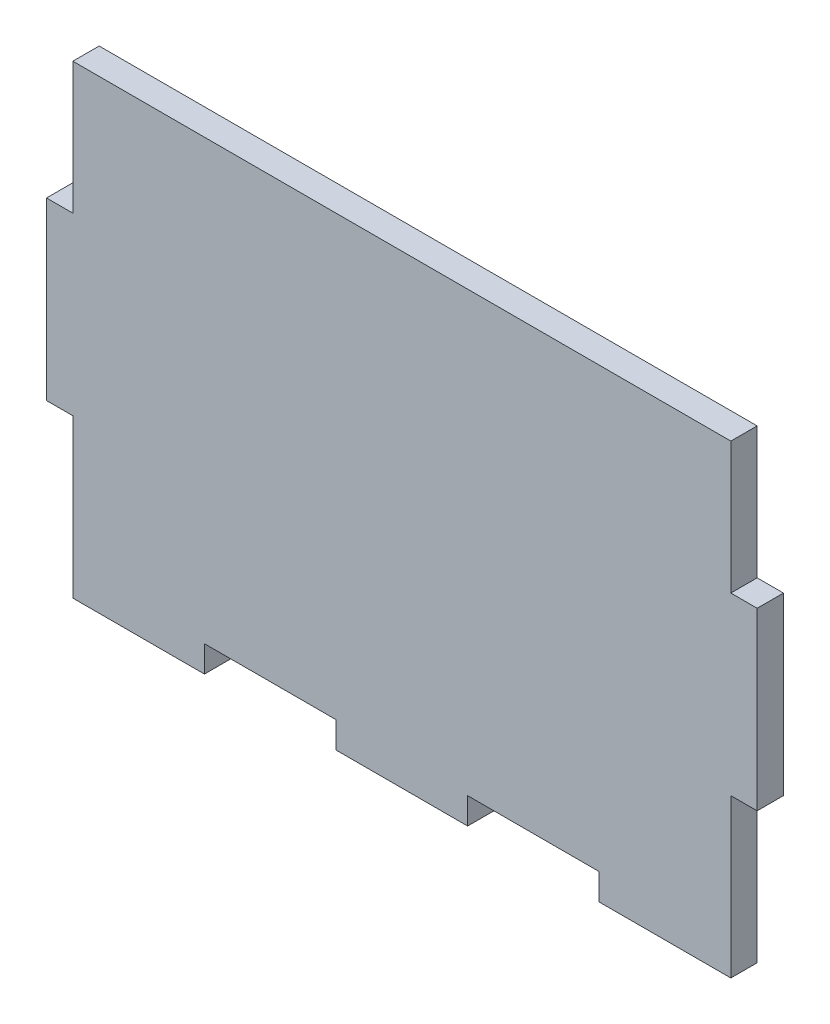
ISO-10303-21;
HEADER;
FILE_DESCRIPTION(('STEP AP214'),'2;1');
FILE_NAME('part.step','',(''),(''),'','','');
FILE_SCHEMA(('AUTOMOTIVE_DESIGN { 1 0 10303 214 1 1 1 1 }'));
ENDSEC;
DATA;
#1=APPLICATION_CONTEXT('core data for automotive mechanical design processes');
#2=APPLICATION_PROTOCOL_DEFINITION('international standard','automotive_design',2000,#1);
#3=PRODUCT_CONTEXT('',#1,'mechanical');
#4=PRODUCT('Part','Part','',(#3));
#5=PRODUCT_RELATED_PRODUCT_CATEGORY('part','',(#4));
#6=PRODUCT_DEFINITION_FORMATION('','',#4);
#7=PRODUCT_DEFINITION_CONTEXT('part definition',#1,'design');
#8=PRODUCT_DEFINITION('design','',#6,#7);
#9=PRODUCT_DEFINITION_SHAPE('','',#8);
#10=(LENGTH_UNIT() NAMED_UNIT(*) SI_UNIT(.MILLI.,.METRE.));
#11=(NAMED_UNIT(*) PLANE_ANGLE_UNIT() SI_UNIT($,.RADIAN.));
#12=(NAMED_UNIT(*) SI_UNIT($,.STERADIAN.) SOLID_ANGLE_UNIT());
#13=UNCERTAINTY_MEASURE_WITH_UNIT(LENGTH_MEASURE(1.E-05),#10,'distance_accuracy_value','');
#14=(GEOMETRIC_REPRESENTATION_CONTEXT(3) GLOBAL_UNCERTAINTY_ASSIGNED_CONTEXT((#13)) GLOBAL_UNIT_ASSIGNED_CONTEXT((#10,
#11,#12)) REPRESENTATION_CONTEXT('',''));
#15=CARTESIAN_POINT('',(0.,0.,0.));
#16=DIRECTION('',(0.,0.,1.));
#17=DIRECTION('',(1.,0.,0.));
#18=AXIS2_PLACEMENT_3D('',#15,#16,#17);
#19=CARTESIAN_POINT('',(-75.,50.,6.));
#20=DIRECTION('',(1.,0.,0.));
#21=DIRECTION('',(0.,0.,-1.));
#22=AXIS2_PLACEMENT_3D('',#19,#20,#21);
#23=PLANE('',#22);
#24=DIRECTION('',(0.,0.,1.));
#25=VECTOR('',#24,1.);
#26=CARTESIAN_POINT('',(-75.,-20.,0.));
#27=LINE('',#26,#25);
#28=CARTESIAN_POINT('',(-75.,-20.,0.));
#29=VERTEX_POINT('',#28);
#30=CARTESIAN_POINT('',(-75.,-20.,6.));
#31=VERTEX_POINT('',#30);
#32=EDGE_CURVE('E192',#29,#31,#27,.T.);
#33=ORIENTED_EDGE('',*,*,#32,.F.);
#34=DIRECTION('',(0.,-1.,0.));
#35=VECTOR('',#34,1.);
#36=CARTESIAN_POINT('',(-75.,50.,0.));
#37=LINE('',#36,#35);
#38=CARTESIAN_POINT('',(-75.,-56.,0.));
#39=VERTEX_POINT('',#38);
#40=EDGE_CURVE('E293',#29,#39,#37,.T.);
#41=ORIENTED_EDGE('',*,*,#40,.T.);
#42=DIRECTION('',(0.,0.,-1.));
#43=VECTOR('',#42,1.);
#44=CARTESIAN_POINT('',(-75.,-56.,6.));
#45=LINE('',#44,#43);
#46=CARTESIAN_POINT('',(-75.,-56.,6.));
#47=VERTEX_POINT('',#46);
#48=EDGE_CURVE('E275',#47,#39,#45,.T.);
#49=ORIENTED_EDGE('',*,*,#48,.F.);
#50=DIRECTION('',(0.,-1.,0.));
#51=VECTOR('',#50,1.);
#52=CARTESIAN_POINT('',(-75.,50.,6.));
#53=LINE('',#52,#51);
#54=EDGE_CURVE('E50',#31,#47,#53,.T.);
#55=ORIENTED_EDGE('',*,*,#54,.F.);
#56=EDGE_LOOP('',(#33,#41,#49,#55));
#57=FACE_BOUND('',#56,.T.);
#58=ADVANCED_FACE('F36',(#57),#23,.F.);
#59=DIRECTION('',(0.,0.,-1.));
#60=VECTOR('',#59,1.);
#61=CARTESIAN_POINT('',(-75.,20.,0.));
#62=LINE('',#61,#60);
#63=CARTESIAN_POINT('',(-75.,20.,6.));
#64=VERTEX_POINT('',#63);
#65=CARTESIAN_POINT('',(-75.,20.,0.));
#66=VERTEX_POINT('',#65);
#67=EDGE_CURVE('E58',#64,#66,#62,.T.);
#68=ORIENTED_EDGE('',*,*,#67,.F.);
#69=CARTESIAN_POINT('',(-75.,50.,6.));
#70=VERTEX_POINT('',#69);
#71=EDGE_CURVE('E195',#70,#64,#53,.T.);
#72=ORIENTED_EDGE('',*,*,#71,.F.);
#73=DIRECTION('',(0.,0.,-1.));
#74=VECTOR('',#73,1.);
#75=CARTESIAN_POINT('',(-75.,50.,6.));
#76=LINE('',#75,#74);
#77=CARTESIAN_POINT('',(-75.,50.,0.));
#78=VERTEX_POINT('',#77);
#79=EDGE_CURVE('E43',#70,#78,#76,.T.);
#80=ORIENTED_EDGE('',*,*,#79,.T.);
#81=EDGE_CURVE('E305',#78,#66,#37,.T.);
#82=ORIENTED_EDGE('',*,*,#81,.T.);
#83=EDGE_LOOP('',(#68,#72,#80,#82));
#84=FACE_BOUND('',#83,.T.);
#85=ADVANCED_FACE('F317',(#84),#23,.F.);
#86=CARTESIAN_POINT('',(75.,50.,6.));
#87=DIRECTION('',(-1.,0.,0.));
#88=DIRECTION('',(0.,0.,1.));
#89=AXIS2_PLACEMENT_3D('',#86,#87,#88);
#90=PLANE('',#89);
#91=DIRECTION('',(0.,0.,1.));
#92=VECTOR('',#91,1.);
#93=CARTESIAN_POINT('',(75.,20.,6.));
#94=LINE('',#93,#92);
#95=CARTESIAN_POINT('',(75.,20.,0.));
#96=VERTEX_POINT('',#95);
#97=CARTESIAN_POINT('',(75.,20.,6.));
#98=VERTEX_POINT('',#97);
#99=EDGE_CURVE('E199',#96,#98,#94,.T.);
#100=ORIENTED_EDGE('',*,*,#99,.F.);
#101=DIRECTION('',(0.,1.,0.));
#102=VECTOR('',#101,1.);
#103=CARTESIAN_POINT('',(75.,50.,0.));
#104=LINE('',#103,#102);
#105=CARTESIAN_POINT('',(75.,50.,0.));
#106=VERTEX_POINT('',#105);
#107=EDGE_CURVE('E310',#96,#106,#104,.T.);
#108=ORIENTED_EDGE('',*,*,#107,.T.);
#109=DIRECTION('',(0.,0.,-1.));
#110=VECTOR('',#109,1.);
#111=CARTESIAN_POINT('',(75.,50.,6.));
#112=LINE('',#111,#110);
#113=CARTESIAN_POINT('',(75.,50.,6.));
#114=VERTEX_POINT('',#113);
#115=EDGE_CURVE('E11',#114,#106,#112,.T.);
#116=ORIENTED_EDGE('',*,*,#115,.F.);
#117=DIRECTION('',(0.,1.,0.));
#118=VECTOR('',#117,1.);
#119=CARTESIAN_POINT('',(75.,50.,6.));
#120=LINE('',#119,#118);
#121=EDGE_CURVE('E299',#98,#114,#120,.T.);
#122=ORIENTED_EDGE('',*,*,#121,.F.);
#123=EDGE_LOOP('',(#100,#108,#116,#122));
#124=FACE_BOUND('',#123,.T.);
#125=ADVANCED_FACE('F390',(#124),#90,.F.);
#126=DIRECTION('',(0.,0.,-1.));
#127=VECTOR('',#126,1.);
#128=CARTESIAN_POINT('',(75.,-20.,6.));
#129=LINE('',#128,#127);
#130=CARTESIAN_POINT('',(75.,-20.,6.));
#131=VERTEX_POINT('',#130);
#132=CARTESIAN_POINT('',(75.,-20.,0.));
#133=VERTEX_POINT('',#132);
#134=EDGE_CURVE('E196',#131,#133,#129,.T.);
#135=ORIENTED_EDGE('',*,*,#134,.F.);
#136=CARTESIAN_POINT('',(75.,-56.,6.));
#137=VERTEX_POINT('',#136);
#138=EDGE_CURVE('E300',#137,#131,#120,.T.);
#139=ORIENTED_EDGE('',*,*,#138,.F.);
#140=DIRECTION('',(0.,0.,1.));
#141=VECTOR('',#140,1.);
#142=CARTESIAN_POINT('',(75.,-56.,6.));
#143=LINE('',#142,#141);
#144=CARTESIAN_POINT('',(75.,-56.,0.));
#145=VERTEX_POINT('',#144);
#146=EDGE_CURVE('E229',#145,#137,#143,.T.);
#147=ORIENTED_EDGE('',*,*,#146,.F.);
#148=EDGE_CURVE('E311',#145,#133,#104,.T.);
#149=ORIENTED_EDGE('',*,*,#148,.T.);
#150=EDGE_LOOP('',(#135,#139,#147,#149));
#151=FACE_BOUND('',#150,.T.);
#152=ADVANCED_FACE('F373',(#151),#90,.F.);
#153=CARTESIAN_POINT('',(75.,-50.,6.));
#154=DIRECTION('',(0.,1.,0.));
#155=DIRECTION('',(-1.,0.,0.));
#156=AXIS2_PLACEMENT_3D('',#153,#154,#155);
#157=PLANE('',#156);
#158=DIRECTION('',(0.,0.,-1.));
#159=VECTOR('',#158,1.);
#160=CARTESIAN_POINT('',(45.,-50.,6.));
#161=LINE('',#160,#159);
#162=CARTESIAN_POINT('',(45.,-50.,6.));
#163=VERTEX_POINT('',#162);
#164=CARTESIAN_POINT('',(45.,-50.,0.));
#165=VERTEX_POINT('',#164);
#166=EDGE_CURVE('E228',#163,#165,#161,.T.);
#167=ORIENTED_EDGE('',*,*,#166,.F.);
#168=DIRECTION('',(1.,0.,0.));
#169=VECTOR('',#168,1.);
#170=CARTESIAN_POINT('',(75.,-50.,6.));
#171=LINE('',#170,#169);
#172=CARTESIAN_POINT('',(15.,-50.,6.));
#173=VERTEX_POINT('',#172);
#174=EDGE_CURVE('E295',#173,#163,#171,.T.);
#175=ORIENTED_EDGE('',*,*,#174,.F.);
#176=DIRECTION('',(0.,0.,1.));
#177=VECTOR('',#176,1.);
#178=CARTESIAN_POINT('',(15.,-50.,6.));
#179=LINE('',#178,#177);
#180=CARTESIAN_POINT('',(15.,-50.,0.));
#181=VERTEX_POINT('',#180);
#182=EDGE_CURVE('E252',#181,#173,#179,.T.);
#183=ORIENTED_EDGE('',*,*,#182,.F.);
#184=DIRECTION('',(1.,0.,0.));
#185=VECTOR('',#184,1.);
#186=CARTESIAN_POINT('',(75.,-50.,0.));
#187=LINE('',#186,#185);
#188=EDGE_CURVE('E307',#181,#165,#187,.T.);
#189=ORIENTED_EDGE('',*,*,#188,.T.);
#190=EDGE_LOOP('',(#167,#175,#183,#189));
#191=FACE_BOUND('',#190,.T.);
#192=ADVANCED_FACE('F363',(#191),#157,.F.);
#193=DIRECTION('',(0.,0.,-1.));
#194=VECTOR('',#193,1.);
#195=CARTESIAN_POINT('',(-15.,-50.,6.));
#196=LINE('',#195,#194);
#197=CARTESIAN_POINT('',(-15.,-50.,6.));
#198=VERTEX_POINT('',#197);
#199=CARTESIAN_POINT('',(-15.,-50.,0.));
#200=VERTEX_POINT('',#199);
#201=EDGE_CURVE('E247',#198,#200,#196,.T.);
#202=ORIENTED_EDGE('',*,*,#201,.F.);
#203=CARTESIAN_POINT('',(-45.,-50.,6.));
#204=VERTEX_POINT('',#203);
#205=EDGE_CURVE('E296',#204,#198,#171,.T.);
#206=ORIENTED_EDGE('',*,*,#205,.F.);
#207=DIRECTION('',(0.,0.,1.));
#208=VECTOR('',#207,1.);
#209=CARTESIAN_POINT('',(-45.,-50.,6.));
#210=LINE('',#209,#208);
#211=CARTESIAN_POINT('',(-45.,-50.,0.));
#212=VERTEX_POINT('',#211);
#213=EDGE_CURVE('E274',#212,#204,#210,.T.);
#214=ORIENTED_EDGE('',*,*,#213,.F.);
#215=EDGE_CURVE('E308',#212,#200,#187,.T.);
#216=ORIENTED_EDGE('',*,*,#215,.T.);
#217=EDGE_LOOP('',(#202,#206,#214,#216));
#218=FACE_BOUND('',#217,.T.);
#219=ADVANCED_FACE('F393',(#218),#157,.F.);
#220=CARTESIAN_POINT('',(75.,50.,6.));
#221=DIRECTION('',(0.,-1.,0.));
#222=DIRECTION('',(1.,0.,0.));
#223=AXIS2_PLACEMENT_3D('',#220,#221,#222);
#224=PLANE('',#223);
#225=DIRECTION('',(-1.,0.,0.));
#226=VECTOR('',#225,1.);
#227=CARTESIAN_POINT('',(75.,50.,0.));
#228=LINE('',#227,#226);
#229=EDGE_CURVE('E313',#106,#78,#228,.T.);
#230=ORIENTED_EDGE('',*,*,#229,.T.);
#231=ORIENTED_EDGE('',*,*,#79,.F.);
#232=DIRECTION('',(-1.,0.,0.));
#233=VECTOR('',#232,1.);
#234=CARTESIAN_POINT('',(75.,50.,6.));
#235=LINE('',#234,#233);
#236=EDGE_CURVE('E303',#114,#70,#235,.T.);
#237=ORIENTED_EDGE('',*,*,#236,.F.);
#238=ORIENTED_EDGE('',*,*,#115,.T.);
#239=EDGE_LOOP('',(#230,#231,#237,#238));
#240=FACE_BOUND('',#239,.T.);
#241=ADVANCED_FACE('F391',(#240),#224,.F.);
#242=CARTESIAN_POINT('',(0.,0.,6.));
#243=DIRECTION('',(0.,0.,-1.));
#244=DIRECTION('',(-1.,0.,0.));
#245=AXIS2_PLACEMENT_3D('',#242,#243,#244);
#246=PLANE('',#245);
#247=ORIENTED_EDGE('',*,*,#71,.T.);
#248=DIRECTION('',(1.,0.,0.));
#249=VECTOR('',#248,1.);
#250=CARTESIAN_POINT('',(-81.,20.,6.));
#251=LINE('',#250,#249);
#252=CARTESIAN_POINT('',(-81.,20.,6.));
#253=VERTEX_POINT('',#252);
#254=EDGE_CURVE('E177',#253,#64,#251,.T.);
#255=ORIENTED_EDGE('',*,*,#254,.F.);
#256=DIRECTION('',(0.,1.,0.));
#257=VECTOR('',#256,1.);
#258=CARTESIAN_POINT('',(-81.,-20.,6.));
#259=LINE('',#258,#257);
#260=CARTESIAN_POINT('',(-81.,-20.,6.));
#261=VERTEX_POINT('',#260);
#262=EDGE_CURVE('E183',#261,#253,#259,.T.);
#263=ORIENTED_EDGE('',*,*,#262,.F.);
#264=DIRECTION('',(1.,0.,0.));
#265=VECTOR('',#264,1.);
#266=CARTESIAN_POINT('',(-81.,-20.,6.));
#267=LINE('',#266,#265);
#268=EDGE_CURVE('E328',#261,#31,#267,.T.);
#269=ORIENTED_EDGE('',*,*,#268,.T.);
#270=ORIENTED_EDGE('',*,*,#54,.T.);
#271=DIRECTION('',(-1.,0.,0.));
#272=VECTOR('',#271,1.);
#273=CARTESIAN_POINT('',(-75.,-56.,6.));
#274=LINE('',#273,#272);
#275=CARTESIAN_POINT('',(-45.,-56.,6.));
#276=VERTEX_POINT('',#275);
#277=EDGE_CURVE('E282',#276,#47,#274,.T.);
#278=ORIENTED_EDGE('',*,*,#277,.F.);
#279=DIRECTION('',(0.,1.,0.));
#280=VECTOR('',#279,1.);
#281=CARTESIAN_POINT('',(-45.,-56.,6.));
#282=LINE('',#281,#280);
#283=EDGE_CURVE('E285',#276,#204,#282,.T.);
#284=ORIENTED_EDGE('',*,*,#283,.T.);
#285=ORIENTED_EDGE('',*,*,#205,.T.);
#286=DIRECTION('',(0.,1.,0.));
#287=VECTOR('',#286,1.);
#288=CARTESIAN_POINT('',(-15.,-56.,6.));
#289=LINE('',#288,#287);
#290=CARTESIAN_POINT('',(-15.,-56.,6.));
#291=VERTEX_POINT('',#290);
#292=EDGE_CURVE('E258',#291,#198,#289,.T.);
#293=ORIENTED_EDGE('',*,*,#292,.F.);
#294=DIRECTION('',(-1.,0.,0.));
#295=VECTOR('',#294,1.);
#296=CARTESIAN_POINT('',(-15.,-56.,6.));
#297=LINE('',#296,#295);
#298=CARTESIAN_POINT('',(15.,-56.,6.));
#299=VERTEX_POINT('',#298);
#300=EDGE_CURVE('E256',#299,#291,#297,.T.);
#301=ORIENTED_EDGE('',*,*,#300,.F.);
#302=DIRECTION('',(0.,1.,0.));
#303=VECTOR('',#302,1.);
#304=CARTESIAN_POINT('',(15.,-56.,6.));
#305=LINE('',#304,#303);
#306=EDGE_CURVE('E265',#299,#173,#305,.T.);
#307=ORIENTED_EDGE('',*,*,#306,.T.);
#308=ORIENTED_EDGE('',*,*,#174,.T.);
#309=DIRECTION('',(0.,1.,0.));
#310=VECTOR('',#309,1.);
#311=CARTESIAN_POINT('',(45.,-56.,6.));
#312=LINE('',#311,#310);
#313=CARTESIAN_POINT('',(45.,-56.,6.));
#314=VERTEX_POINT('',#313);
#315=EDGE_CURVE('E244',#314,#163,#312,.T.);
#316=ORIENTED_EDGE('',*,*,#315,.F.);
#317=DIRECTION('',(-1.,0.,0.));
#318=VECTOR('',#317,1.);
#319=CARTESIAN_POINT('',(75.,-56.,6.));
#320=LINE('',#319,#318);
#321=EDGE_CURVE('E232',#137,#314,#320,.T.);
#322=ORIENTED_EDGE('',*,*,#321,.F.);
#323=ORIENTED_EDGE('',*,*,#138,.T.);
#324=DIRECTION('',(-1.,0.,0.));
#325=VECTOR('',#324,1.);
#326=CARTESIAN_POINT('',(81.,-20.,6.));
#327=LINE('',#326,#325);
#328=CARTESIAN_POINT('',(81.,-20.,6.));
#329=VERTEX_POINT('',#328);
#330=EDGE_CURVE('E225',#329,#131,#327,.T.);
#331=ORIENTED_EDGE('',*,*,#330,.F.);
#332=DIRECTION('',(0.,-1.,0.));
#333=VECTOR('',#332,1.);
#334=CARTESIAN_POINT('',(81.,20.,6.));
#335=LINE('',#334,#333);
#336=CARTESIAN_POINT('',(81.,20.,6.));
#337=VERTEX_POINT('',#336);
#338=EDGE_CURVE('E205',#337,#329,#335,.T.);
#339=ORIENTED_EDGE('',*,*,#338,.F.);
#340=DIRECTION('',(-1.,0.,0.));
#341=VECTOR('',#340,1.);
#342=CARTESIAN_POINT('',(81.,20.,6.));
#343=LINE('',#342,#341);
#344=EDGE_CURVE('E213',#337,#98,#343,.T.);
#345=ORIENTED_EDGE('',*,*,#344,.T.);
#346=ORIENTED_EDGE('',*,*,#121,.T.);
#347=ORIENTED_EDGE('',*,*,#236,.T.);
#348=EDGE_LOOP('',(#247,#255,#263,#269,#270,#278,#284,#285,#293,#301,#307,#308,#316,#322,#323,
#331,#339,#345,#346,#347));
#349=FACE_BOUND('',#348,.T.);
#350=ADVANCED_FACE('F194',(#349),#246,.F.);
#351=CARTESIAN_POINT('',(0.,0.,0.));
#352=DIRECTION('',(0.,0.,-1.));
#353=DIRECTION('',(-1.,0.,0.));
#354=AXIS2_PLACEMENT_3D('',#351,#352,#353);
#355=PLANE('',#354);
#356=ORIENTED_EDGE('',*,*,#81,.F.);
#357=ORIENTED_EDGE('',*,*,#229,.F.);
#358=ORIENTED_EDGE('',*,*,#107,.F.);
#359=DIRECTION('',(-1.,0.,0.));
#360=VECTOR('',#359,1.);
#361=CARTESIAN_POINT('',(81.,20.,0.));
#362=LINE('',#361,#360);
#363=CARTESIAN_POINT('',(81.,20.,0.));
#364=VERTEX_POINT('',#363);
#365=EDGE_CURVE('E219',#364,#96,#362,.T.);
#366=ORIENTED_EDGE('',*,*,#365,.F.);
#367=DIRECTION('',(0.,1.,0.));
#368=VECTOR('',#367,1.);
#369=CARTESIAN_POINT('',(81.,20.,0.));
#370=LINE('',#369,#368);
#371=CARTESIAN_POINT('',(81.,-20.,0.));
#372=VERTEX_POINT('',#371);
#373=EDGE_CURVE('E210',#372,#364,#370,.T.);
#374=ORIENTED_EDGE('',*,*,#373,.F.);
#375=DIRECTION('',(-1.,0.,0.));
#376=VECTOR('',#375,1.);
#377=CARTESIAN_POINT('',(81.,-20.,0.));
#378=LINE('',#377,#376);
#379=EDGE_CURVE('E222',#372,#133,#378,.T.);
#380=ORIENTED_EDGE('',*,*,#379,.T.);
#381=ORIENTED_EDGE('',*,*,#148,.F.);
#382=DIRECTION('',(1.,0.,0.));
#383=VECTOR('',#382,1.);
#384=CARTESIAN_POINT('',(75.,-56.,0.));
#385=LINE('',#384,#383);
#386=CARTESIAN_POINT('',(45.,-56.,0.));
#387=VERTEX_POINT('',#386);
#388=EDGE_CURVE('E236',#387,#145,#385,.T.);
#389=ORIENTED_EDGE('',*,*,#388,.F.);
#390=DIRECTION('',(0.,1.,0.));
#391=VECTOR('',#390,1.);
#392=CARTESIAN_POINT('',(45.,-56.,0.));
#393=LINE('',#392,#391);
#394=EDGE_CURVE('E239',#387,#165,#393,.T.);
#395=ORIENTED_EDGE('',*,*,#394,.T.);
#396=ORIENTED_EDGE('',*,*,#188,.F.);
#397=DIRECTION('',(0.,1.,0.));
#398=VECTOR('',#397,1.);
#399=CARTESIAN_POINT('',(15.,-56.,0.));
#400=LINE('',#399,#398);
#401=CARTESIAN_POINT('',(15.,-56.,0.));
#402=VERTEX_POINT('',#401);
#403=EDGE_CURVE('E268',#402,#181,#400,.T.);
#404=ORIENTED_EDGE('',*,*,#403,.F.);
#405=DIRECTION('',(1.,0.,0.));
#406=VECTOR('',#405,1.);
#407=CARTESIAN_POINT('',(-15.,-56.,0.));
#408=LINE('',#407,#406);
#409=CARTESIAN_POINT('',(-15.,-56.,0.));
#410=VERTEX_POINT('',#409);
#411=EDGE_CURVE('E251',#410,#402,#408,.T.);
#412=ORIENTED_EDGE('',*,*,#411,.F.);
#413=DIRECTION('',(0.,1.,0.));
#414=VECTOR('',#413,1.);
#415=CARTESIAN_POINT('',(-15.,-56.,0.));
#416=LINE('',#415,#414);
#417=EDGE_CURVE('E271',#410,#200,#416,.T.);
#418=ORIENTED_EDGE('',*,*,#417,.T.);
#419=ORIENTED_EDGE('',*,*,#215,.F.);
#420=DIRECTION('',(0.,1.,0.));
#421=VECTOR('',#420,1.);
#422=CARTESIAN_POINT('',(-45.,-56.,0.));
#423=LINE('',#422,#421);
#424=CARTESIAN_POINT('',(-45.,-56.,0.));
#425=VERTEX_POINT('',#424);
#426=EDGE_CURVE('E290',#425,#212,#423,.T.);
#427=ORIENTED_EDGE('',*,*,#426,.F.);
#428=DIRECTION('',(1.,0.,0.));
#429=VECTOR('',#428,1.);
#430=CARTESIAN_POINT('',(-75.,-56.,0.));
#431=LINE('',#430,#429);
#432=EDGE_CURVE('E278',#39,#425,#431,.T.);
#433=ORIENTED_EDGE('',*,*,#432,.F.);
#434=ORIENTED_EDGE('',*,*,#40,.F.);
#435=DIRECTION('',(1.,0.,0.));
#436=VECTOR('',#435,1.);
#437=CARTESIAN_POINT('',(-81.,-20.,0.));
#438=LINE('',#437,#436);
#439=CARTESIAN_POINT('',(-81.,-20.,0.));
#440=VERTEX_POINT('',#439);
#441=EDGE_CURVE('E201',#440,#29,#438,.T.);
#442=ORIENTED_EDGE('',*,*,#441,.F.);
#443=DIRECTION('',(0.,-1.,0.));
#444=VECTOR('',#443,1.);
#445=CARTESIAN_POINT('',(-81.,-20.,0.));
#446=LINE('',#445,#444);
#447=CARTESIAN_POINT('',(-81.,20.,0.));
#448=VERTEX_POINT('',#447);
#449=EDGE_CURVE('E182',#448,#440,#446,.T.);
#450=ORIENTED_EDGE('',*,*,#449,.F.);
#451=DIRECTION('',(1.,0.,0.));
#452=VECTOR('',#451,1.);
#453=CARTESIAN_POINT('',(-81.,20.,0.));
#454=LINE('',#453,#452);
#455=EDGE_CURVE('E179',#448,#66,#454,.T.);
#456=ORIENTED_EDGE('',*,*,#455,.T.);
#457=EDGE_LOOP('',(#356,#357,#358,#366,#374,#380,#381,#389,#395,#396,#404,#412,#418,#419,#427,
#433,#434,#442,#450,#456));
#458=FACE_BOUND('',#457,.T.);
#459=ADVANCED_FACE('F322',(#458),#355,.T.);
#460=CARTESIAN_POINT('',(-45.,-56.,6.));
#461=DIRECTION('',(-1.,0.,0.));
#462=DIRECTION('',(0.,-1.,0.));
#463=AXIS2_PLACEMENT_3D('',#460,#461,#462);
#464=PLANE('',#463);
#465=ORIENTED_EDGE('',*,*,#213,.T.);
#466=ORIENTED_EDGE('',*,*,#283,.F.);
#467=DIRECTION('',(0.,0.,1.));
#468=VECTOR('',#467,1.);
#469=CARTESIAN_POINT('',(-45.,-56.,6.));
#470=LINE('',#469,#468);
#471=EDGE_CURVE('E280',#425,#276,#470,.T.);
#472=ORIENTED_EDGE('',*,*,#471,.F.);
#473=ORIENTED_EDGE('',*,*,#426,.T.);
#474=EDGE_LOOP('',(#465,#466,#472,#473));
#475=FACE_BOUND('',#474,.T.);
#476=ADVANCED_FACE('F344',(#475),#464,.F.);
#477=CARTESIAN_POINT('',(0.,-56.,0.));
#478=DIRECTION('',(0.,-1.,0.));
#479=DIRECTION('',(0.,0.,-1.));
#480=AXIS2_PLACEMENT_3D('',#477,#478,#479);
#481=PLANE('',#480);
#482=ORIENTED_EDGE('',*,*,#48,.T.);
#483=ORIENTED_EDGE('',*,*,#432,.T.);
#484=ORIENTED_EDGE('',*,*,#471,.T.);
#485=ORIENTED_EDGE('',*,*,#277,.T.);
#486=EDGE_LOOP('',(#482,#483,#484,#485));
#487=FACE_BOUND('',#486,.T.);
#488=ADVANCED_FACE('F337',(#487),#481,.T.);
#489=CARTESIAN_POINT('',(-15.,-56.,6.));
#490=DIRECTION('',(1.,0.,0.));
#491=DIRECTION('',(0.,1.,0.));
#492=AXIS2_PLACEMENT_3D('',#489,#490,#491);
#493=PLANE('',#492);
#494=ORIENTED_EDGE('',*,*,#201,.T.);
#495=ORIENTED_EDGE('',*,*,#417,.F.);
#496=DIRECTION('',(0.,0.,-1.));
#497=VECTOR('',#496,1.);
#498=CARTESIAN_POINT('',(-15.,-56.,6.));
#499=LINE('',#498,#497);
#500=EDGE_CURVE('E248',#291,#410,#499,.T.);
#501=ORIENTED_EDGE('',*,*,#500,.F.);
#502=ORIENTED_EDGE('',*,*,#292,.T.);
#503=EDGE_LOOP('',(#494,#495,#501,#502));
#504=FACE_BOUND('',#503,.T.);
#505=ADVANCED_FACE('F350',(#504),#493,.F.);
#506=CARTESIAN_POINT('',(15.,-56.,6.));
#507=DIRECTION('',(-1.,0.,0.));
#508=DIRECTION('',(0.,-1.,0.));
#509=AXIS2_PLACEMENT_3D('',#506,#507,#508);
#510=PLANE('',#509);
#511=ORIENTED_EDGE('',*,*,#182,.T.);
#512=ORIENTED_EDGE('',*,*,#306,.F.);
#513=DIRECTION('',(0.,0.,1.));
#514=VECTOR('',#513,1.);
#515=CARTESIAN_POINT('',(15.,-56.,6.));
#516=LINE('',#515,#514);
#517=EDGE_CURVE('E254',#402,#299,#516,.T.);
#518=ORIENTED_EDGE('',*,*,#517,.F.);
#519=ORIENTED_EDGE('',*,*,#403,.T.);
#520=EDGE_LOOP('',(#511,#512,#518,#519));
#521=FACE_BOUND('',#520,.T.);
#522=ADVANCED_FACE('F360',(#521),#510,.F.);
#523=CARTESIAN_POINT('',(0.,-56.,0.));
#524=DIRECTION('',(0.,-1.,0.));
#525=DIRECTION('',(0.,0.,-1.));
#526=AXIS2_PLACEMENT_3D('',#523,#524,#525);
#527=PLANE('',#526);
#528=ORIENTED_EDGE('',*,*,#500,.T.);
#529=ORIENTED_EDGE('',*,*,#411,.T.);
#530=ORIENTED_EDGE('',*,*,#517,.T.);
#531=ORIENTED_EDGE('',*,*,#300,.T.);
#532=EDGE_LOOP('',(#528,#529,#530,#531));
#533=FACE_BOUND('',#532,.T.);
#534=ADVANCED_FACE('F353',(#533),#527,.T.);
#535=CARTESIAN_POINT('',(45.,-56.,6.));
#536=DIRECTION('',(1.,0.,0.));
#537=DIRECTION('',(0.,1.,0.));
#538=AXIS2_PLACEMENT_3D('',#535,#536,#537);
#539=PLANE('',#538);
#540=ORIENTED_EDGE('',*,*,#166,.T.);
#541=ORIENTED_EDGE('',*,*,#394,.F.);
#542=DIRECTION('',(0.,0.,-1.));
#543=VECTOR('',#542,1.);
#544=CARTESIAN_POINT('',(45.,-56.,6.));
#545=LINE('',#544,#543);
#546=EDGE_CURVE('E234',#314,#387,#545,.T.);
#547=ORIENTED_EDGE('',*,*,#546,.F.);
#548=ORIENTED_EDGE('',*,*,#315,.T.);
#549=EDGE_LOOP('',(#540,#541,#547,#548));
#550=FACE_BOUND('',#549,.T.);
#551=ADVANCED_FACE('F366',(#550),#539,.F.);
#552=CARTESIAN_POINT('',(0.,-56.,0.));
#553=DIRECTION('',(0.,1.,0.));
#554=DIRECTION('',(0.,0.,1.));
#555=AXIS2_PLACEMENT_3D('',#552,#553,#554);
#556=PLANE('',#555);
#557=ORIENTED_EDGE('',*,*,#146,.T.);
#558=ORIENTED_EDGE('',*,*,#321,.T.);
#559=ORIENTED_EDGE('',*,*,#546,.T.);
#560=ORIENTED_EDGE('',*,*,#388,.T.);
#561=EDGE_LOOP('',(#557,#558,#559,#560));
#562=FACE_BOUND('',#561,.T.);
#563=ADVANCED_FACE('F371',(#562),#556,.F.);
#564=CARTESIAN_POINT('',(81.,-20.,6.));
#565=DIRECTION('',(0.,1.,0.));
#566=DIRECTION('',(0.,0.,1.));
#567=AXIS2_PLACEMENT_3D('',#564,#565,#566);
#568=PLANE('',#567);
#569=ORIENTED_EDGE('',*,*,#134,.T.);
#570=ORIENTED_EDGE('',*,*,#379,.F.);
#571=DIRECTION('',(0.,0.,-1.));
#572=VECTOR('',#571,1.);
#573=CARTESIAN_POINT('',(81.,-20.,6.));
#574=LINE('',#573,#572);
#575=EDGE_CURVE('E208',#329,#372,#574,.T.);
#576=ORIENTED_EDGE('',*,*,#575,.F.);
#577=ORIENTED_EDGE('',*,*,#330,.T.);
#578=EDGE_LOOP('',(#569,#570,#576,#577));
#579=FACE_BOUND('',#578,.T.);
#580=ADVANCED_FACE('F378',(#579),#568,.F.);
#581=CARTESIAN_POINT('',(81.,20.,6.));
#582=DIRECTION('',(0.,-1.,0.));
#583=DIRECTION('',(0.,0.,-1.));
#584=AXIS2_PLACEMENT_3D('',#581,#582,#583);
#585=PLANE('',#584);
#586=ORIENTED_EDGE('',*,*,#99,.T.);
#587=ORIENTED_EDGE('',*,*,#344,.F.);
#588=DIRECTION('',(0.,0.,1.));
#589=VECTOR('',#588,1.);
#590=CARTESIAN_POINT('',(81.,20.,6.));
#591=LINE('',#590,#589);
#592=EDGE_CURVE('E212',#364,#337,#591,.T.);
#593=ORIENTED_EDGE('',*,*,#592,.F.);
#594=ORIENTED_EDGE('',*,*,#365,.T.);
#595=EDGE_LOOP('',(#586,#587,#593,#594));
#596=FACE_BOUND('',#595,.T.);
#597=ADVANCED_FACE('F387',(#596),#585,.F.);
#598=CARTESIAN_POINT('',(81.,0.,0.));
#599=DIRECTION('',(1.,0.,0.));
#600=DIRECTION('',(0.,0.,-1.));
#601=AXIS2_PLACEMENT_3D('',#598,#599,#600);
#602=PLANE('',#601);
#603=ORIENTED_EDGE('',*,*,#338,.T.);
#604=ORIENTED_EDGE('',*,*,#575,.T.);
#605=ORIENTED_EDGE('',*,*,#373,.T.);
#606=ORIENTED_EDGE('',*,*,#592,.T.);
#607=EDGE_LOOP('',(#603,#604,#605,#606));
#608=FACE_BOUND('',#607,.T.);
#609=ADVANCED_FACE('F382',(#608),#602,.T.);
#610=CARTESIAN_POINT('',(-81.,20.,0.));
#611=DIRECTION('',(0.,-1.,0.));
#612=DIRECTION('',(0.,0.,-1.));
#613=AXIS2_PLACEMENT_3D('',#610,#611,#612);
#614=PLANE('',#613);
#615=ORIENTED_EDGE('',*,*,#67,.T.);
#616=ORIENTED_EDGE('',*,*,#455,.F.);
#617=DIRECTION('',(0.,0.,-1.));
#618=VECTOR('',#617,1.);
#619=CARTESIAN_POINT('',(-81.,20.,0.));
#620=LINE('',#619,#618);
#621=EDGE_CURVE('E173',#253,#448,#620,.T.);
#622=ORIENTED_EDGE('',*,*,#621,.F.);
#623=ORIENTED_EDGE('',*,*,#254,.T.);
#624=EDGE_LOOP('',(#615,#616,#622,#623));
#625=FACE_BOUND('',#624,.T.);
#626=ADVANCED_FACE('F175',(#625),#614,.F.);
#627=CARTESIAN_POINT('',(-81.,-20.,0.));
#628=DIRECTION('',(0.,1.,0.));
#629=DIRECTION('',(0.,0.,1.));
#630=AXIS2_PLACEMENT_3D('',#627,#628,#629);
#631=PLANE('',#630);
#632=ORIENTED_EDGE('',*,*,#32,.T.);
#633=ORIENTED_EDGE('',*,*,#268,.F.);
#634=DIRECTION('',(0.,0.,1.));
#635=VECTOR('',#634,1.);
#636=CARTESIAN_POINT('',(-81.,-20.,0.));
#637=LINE('',#636,#635);
#638=EDGE_CURVE('E188',#440,#261,#637,.T.);
#639=ORIENTED_EDGE('',*,*,#638,.F.);
#640=ORIENTED_EDGE('',*,*,#441,.T.);
#641=EDGE_LOOP('',(#632,#633,#639,#640));
#642=FACE_BOUND('',#641,.T.);
#643=ADVANCED_FACE('F334',(#642),#631,.F.);
#644=CARTESIAN_POINT('',(-81.,0.,0.));
#645=DIRECTION('',(1.,0.,0.));
#646=DIRECTION('',(0.,0.,-1.));
#647=AXIS2_PLACEMENT_3D('',#644,#645,#646);
#648=PLANE('',#647);
#649=ORIENTED_EDGE('',*,*,#262,.T.);
#650=ORIENTED_EDGE('',*,*,#621,.T.);
#651=ORIENTED_EDGE('',*,*,#449,.T.);
#652=ORIENTED_EDGE('',*,*,#638,.T.);
#653=EDGE_LOOP('',(#649,#650,#651,#652));
#654=FACE_BOUND('',#653,.T.);
#655=ADVANCED_FACE('F186',(#654),#648,.F.);
#656=CLOSED_SHELL('',(#58,#85,#125,#152,#192,#219,#241,#350,#459,#476,#488,#505,#522,#534,#551,
#563,#580,#597,#609,#626,#643,#655));
#657=MANIFOLD_SOLID_BREP('B2',#656);
#658=ADVANCED_BREP_SHAPE_REPRESENTATION('',(#18,#657),#14);
#659=SHAPE_DEFINITION_REPRESENTATION(#9,#658);
ENDSEC;
END-ISO-10303-21;
